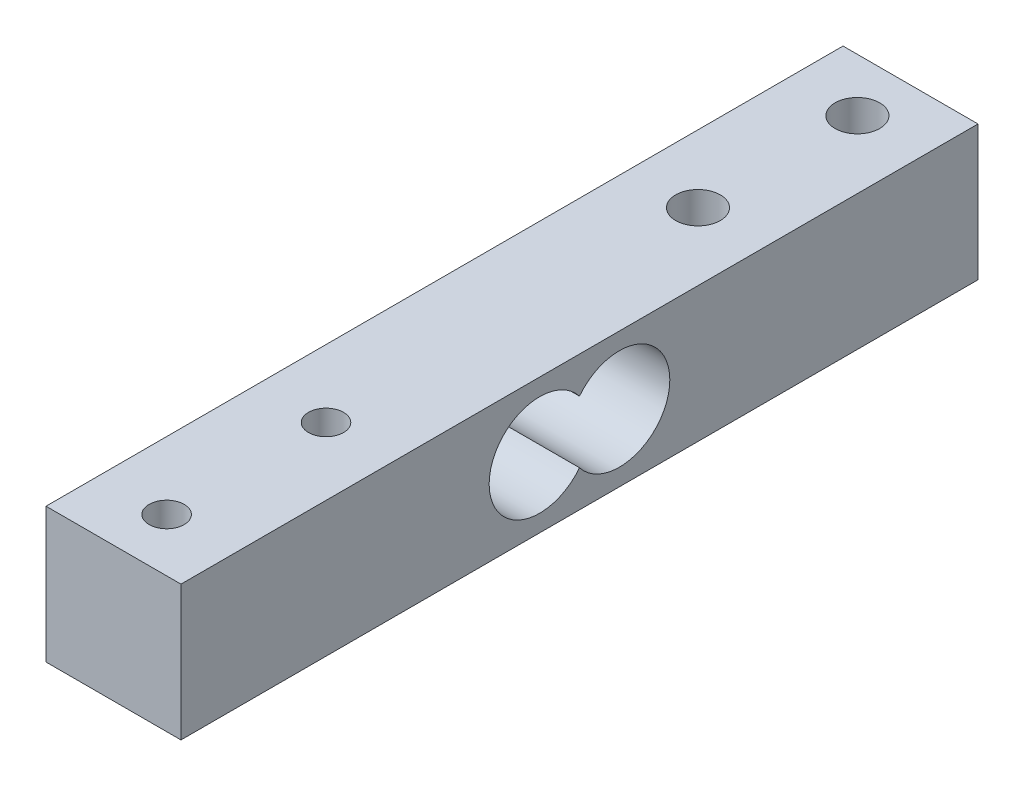
ISO-10303-21;
HEADER;
FILE_DESCRIPTION(('STEP AP214'),'2;1');
FILE_NAME('part.step','',(''),(''),'','','');
FILE_SCHEMA(('AUTOMOTIVE_DESIGN { 1 0 10303 214 1 1 1 1 }'));
ENDSEC;
DATA;
#1=APPLICATION_CONTEXT('core data for automotive mechanical design processes');
#2=APPLICATION_PROTOCOL_DEFINITION('international standard','automotive_design',2000,#1);
#3=PRODUCT_CONTEXT('',#1,'mechanical');
#4=PRODUCT('Part','Part','',(#3));
#5=PRODUCT_RELATED_PRODUCT_CATEGORY('part','',(#4));
#6=PRODUCT_DEFINITION_FORMATION('','',#4);
#7=PRODUCT_DEFINITION_CONTEXT('part definition',#1,'design');
#8=PRODUCT_DEFINITION('design','',#6,#7);
#9=PRODUCT_DEFINITION_SHAPE('','',#8);
#10=(LENGTH_UNIT() NAMED_UNIT(*) SI_UNIT(.MILLI.,.METRE.));
#11=(NAMED_UNIT(*) PLANE_ANGLE_UNIT() SI_UNIT($,.RADIAN.));
#12=(NAMED_UNIT(*) SI_UNIT($,.STERADIAN.) SOLID_ANGLE_UNIT());
#13=UNCERTAINTY_MEASURE_WITH_UNIT(LENGTH_MEASURE(1.E-05),#10,'distance_accuracy_value','');
#14=(GEOMETRIC_REPRESENTATION_CONTEXT(3) GLOBAL_UNCERTAINTY_ASSIGNED_CONTEXT((#13)) GLOBAL_UNIT_ASSIGNED_CONTEXT((#10,
#11,#12)) REPRESENTATION_CONTEXT('',''));
#15=CARTESIAN_POINT('',(0.,0.,0.));
#16=DIRECTION('',(0.,0.,1.));
#17=DIRECTION('',(1.,0.,0.));
#18=AXIS2_PLACEMENT_3D('',#15,#16,#17);
#19=CARTESIAN_POINT('',(6.35,6.35,-37.5));
#20=DIRECTION('',(-1.,0.,0.));
#21=DIRECTION('',(0.,0.,1.));
#22=AXIS2_PLACEMENT_3D('',#19,#20,#21);
#23=PLANE('',#22);
#24=CARTESIAN_POINT('',(6.35000000000001,0.,-3.75));
#25=DIRECTION('',(-1.,0.,0.));
#26=DIRECTION('',(0.,0.,1.));
#27=AXIS2_PLACEMENT_3D('',#24,#25,#26);
#28=CIRCLE('',#27,4.75);
#29=CARTESIAN_POINT('',(6.35000000000001,2.91547594742265,0.));
#30=VERTEX_POINT('',#29);
#31=CARTESIAN_POINT('',(6.35,-2.91547594742265,0.));
#32=VERTEX_POINT('',#31);
#33=EDGE_CURVE('E96',#30,#32,#28,.T.);
#34=ORIENTED_EDGE('',*,*,#33,.T.);
#35=CARTESIAN_POINT('',(6.35000000000001,0.,3.75));
#36=DIRECTION('',(-1.,0.,0.));
#37=DIRECTION('',(0.,0.,1.));
#38=AXIS2_PLACEMENT_3D('',#35,#36,#37);
#39=CIRCLE('',#38,4.75);
#40=EDGE_CURVE('E55',#32,#30,#39,.T.);
#41=ORIENTED_EDGE('',*,*,#40,.T.);
#42=EDGE_LOOP('',(#34,#41));
#43=FACE_BOUND('',#42,.T.);
#44=DIRECTION('',(0.,0.,-1.));
#45=VECTOR('',#44,1.);
#46=CARTESIAN_POINT('',(6.35,-6.35,-37.5));
#47=LINE('',#46,#45);
#48=CARTESIAN_POINT('',(6.35000000000001,-6.35,37.5));
#49=VERTEX_POINT('',#48);
#50=CARTESIAN_POINT('',(6.35,-6.35,-37.5));
#51=VERTEX_POINT('',#50);
#52=EDGE_CURVE('E125',#49,#51,#47,.T.);
#53=ORIENTED_EDGE('',*,*,#52,.T.);
#54=DIRECTION('',(0.,-1.,0.));
#55=VECTOR('',#54,1.);
#56=CARTESIAN_POINT('',(6.35,6.35,-37.5));
#57=LINE('',#56,#55);
#58=CARTESIAN_POINT('',(6.35,6.35,-37.5));
#59=VERTEX_POINT('',#58);
#60=EDGE_CURVE('E11',#59,#51,#57,.T.);
#61=ORIENTED_EDGE('',*,*,#60,.F.);
#62=DIRECTION('',(0.,0.,-1.));
#63=VECTOR('',#62,1.);
#64=CARTESIAN_POINT('',(6.35,6.35,-37.5));
#65=LINE('',#64,#63);
#66=CARTESIAN_POINT('',(6.35000000000001,6.35,37.5));
#67=VERTEX_POINT('',#66);
#68=EDGE_CURVE('E126',#67,#59,#65,.T.);
#69=ORIENTED_EDGE('',*,*,#68,.F.);
#70=DIRECTION('',(0.,-1.,0.));
#71=VECTOR('',#70,1.);
#72=CARTESIAN_POINT('',(6.35000000000001,6.35,37.5));
#73=LINE('',#72,#71);
#74=EDGE_CURVE('E136',#67,#49,#73,.T.);
#75=ORIENTED_EDGE('',*,*,#74,.T.);
#76=EDGE_LOOP('',(#53,#61,#69,#75));
#77=FACE_BOUND('',#76,.T.);
#78=ADVANCED_FACE('F39',(#43,#77),#23,.F.);
#79=CARTESIAN_POINT('',(-6.35,6.35,-37.5));
#80=DIRECTION('',(0.,0.,1.));
#81=DIRECTION('',(1.,0.,0.));
#82=AXIS2_PLACEMENT_3D('',#79,#80,#81);
#83=PLANE('',#82);
#84=DIRECTION('',(-1.,0.,0.));
#85=VECTOR('',#84,1.);
#86=CARTESIAN_POINT('',(-6.35,-6.35,-37.5));
#87=LINE('',#86,#85);
#88=CARTESIAN_POINT('',(-6.35,-6.35,-37.5));
#89=VERTEX_POINT('',#88);
#90=EDGE_CURVE('E139',#51,#89,#87,.T.);
#91=ORIENTED_EDGE('',*,*,#90,.T.);
#92=DIRECTION('',(0.,-1.,0.));
#93=VECTOR('',#92,1.);
#94=CARTESIAN_POINT('',(-6.35,6.35,-37.5));
#95=LINE('',#94,#93);
#96=CARTESIAN_POINT('',(-6.35,6.35,-37.5));
#97=VERTEX_POINT('',#96);
#98=EDGE_CURVE('E47',#97,#89,#95,.T.);
#99=ORIENTED_EDGE('',*,*,#98,.F.);
#100=DIRECTION('',(-1.,0.,0.));
#101=VECTOR('',#100,1.);
#102=CARTESIAN_POINT('',(-6.35,6.35,-37.5));
#103=LINE('',#102,#101);
#104=EDGE_CURVE('E129',#59,#97,#103,.T.);
#105=ORIENTED_EDGE('',*,*,#104,.F.);
#106=ORIENTED_EDGE('',*,*,#60,.T.);
#107=EDGE_LOOP('',(#91,#99,#105,#106));
#108=FACE_BOUND('',#107,.T.);
#109=ADVANCED_FACE('F184',(#108),#83,.F.);
#110=CARTESIAN_POINT('',(-6.35,6.35,-37.5));
#111=DIRECTION('',(1.,0.,0.));
#112=DIRECTION('',(0.,0.,-1.));
#113=AXIS2_PLACEMENT_3D('',#110,#111,#112);
#114=PLANE('',#113);
#115=CARTESIAN_POINT('',(-6.35,0.,-3.75));
#116=DIRECTION('',(-1.,0.,0.));
#117=DIRECTION('',(0.,0.,1.));
#118=AXIS2_PLACEMENT_3D('',#115,#116,#117);
#119=CIRCLE('',#118,4.75);
#120=CARTESIAN_POINT('',(-6.35,2.91547594742265,0.));
#121=VERTEX_POINT('',#120);
#122=CARTESIAN_POINT('',(-6.35,-2.91547594742265,0.));
#123=VERTEX_POINT('',#122);
#124=EDGE_CURVE('E103',#121,#123,#119,.T.);
#125=ORIENTED_EDGE('',*,*,#124,.F.);
#126=CARTESIAN_POINT('',(-6.35,0.,3.75));
#127=DIRECTION('',(-1.,0.,0.));
#128=DIRECTION('',(0.,0.,1.));
#129=AXIS2_PLACEMENT_3D('',#126,#127,#128);
#130=CIRCLE('',#129,4.75);
#131=EDGE_CURVE('E60',#123,#121,#130,.T.);
#132=ORIENTED_EDGE('',*,*,#131,.F.);
#133=EDGE_LOOP('',(#125,#132));
#134=FACE_BOUND('',#133,.T.);
#135=DIRECTION('',(0.,0.,1.));
#136=VECTOR('',#135,1.);
#137=CARTESIAN_POINT('',(-6.35,-6.35,-37.5));
#138=LINE('',#137,#136);
#139=CARTESIAN_POINT('',(-6.34999999999999,-6.35,37.5));
#140=VERTEX_POINT('',#139);
#141=EDGE_CURVE('E141',#89,#140,#138,.T.);
#142=ORIENTED_EDGE('',*,*,#141,.T.);
#143=DIRECTION('',(0.,-1.,0.));
#144=VECTOR('',#143,1.);
#145=CARTESIAN_POINT('',(-6.34999999999999,6.35,37.5));
#146=LINE('',#145,#144);
#147=CARTESIAN_POINT('',(-6.34999999999999,6.35,37.5));
#148=VERTEX_POINT('',#147);
#149=EDGE_CURVE('E146',#148,#140,#146,.T.);
#150=ORIENTED_EDGE('',*,*,#149,.F.);
#151=DIRECTION('',(0.,0.,1.));
#152=VECTOR('',#151,1.);
#153=CARTESIAN_POINT('',(-6.35,6.35,-37.5));
#154=LINE('',#153,#152);
#155=EDGE_CURVE('E132',#97,#148,#154,.T.);
#156=ORIENTED_EDGE('',*,*,#155,.F.);
#157=ORIENTED_EDGE('',*,*,#98,.T.);
#158=EDGE_LOOP('',(#142,#150,#156,#157));
#159=FACE_BOUND('',#158,.T.);
#160=ADVANCED_FACE('F189',(#134,#159),#114,.F.);
#161=CARTESIAN_POINT('',(-6.34999999999999,6.35,37.5));
#162=DIRECTION('',(0.,0.,-1.));
#163=DIRECTION('',(-1.,0.,0.));
#164=AXIS2_PLACEMENT_3D('',#161,#162,#163);
#165=PLANE('',#164);
#166=DIRECTION('',(1.,0.,0.));
#167=VECTOR('',#166,1.);
#168=CARTESIAN_POINT('',(-6.34999999999999,-6.35,37.5));
#169=LINE('',#168,#167);
#170=EDGE_CURVE('E130',#140,#49,#169,.T.);
#171=ORIENTED_EDGE('',*,*,#170,.T.);
#172=ORIENTED_EDGE('',*,*,#74,.F.);
#173=DIRECTION('',(1.,0.,0.));
#174=VECTOR('',#173,1.);
#175=CARTESIAN_POINT('',(-6.34999999999999,6.35,37.5));
#176=LINE('',#175,#174);
#177=EDGE_CURVE('E134',#148,#67,#176,.T.);
#178=ORIENTED_EDGE('',*,*,#177,.F.);
#179=ORIENTED_EDGE('',*,*,#149,.T.);
#180=EDGE_LOOP('',(#171,#172,#178,#179));
#181=FACE_BOUND('',#180,.T.);
#182=ADVANCED_FACE('F170',(#181),#165,.F.);
#183=CARTESIAN_POINT('',(0.,6.35,0.));
#184=DIRECTION('',(0.,1.,0.));
#185=DIRECTION('',(0.,0.,1.));
#186=AXIS2_PLACEMENT_3D('',#183,#184,#185);
#187=PLANE('',#186);
#188=CARTESIAN_POINT('',(0.,6.35,-32.5));
#189=DIRECTION('',(0.,1.,0.));
#190=DIRECTION('',(0.,0.,1.));
#191=AXIS2_PLACEMENT_3D('',#188,#189,#190);
#192=CIRCLE('',#191,2.1);
#193=CARTESIAN_POINT('',(0.,6.35,-30.4));
#194=VERTEX_POINT('',#193);
#195=EDGE_CURVE('E157',#194,#194,#192,.T.);
#196=ORIENTED_EDGE('',*,*,#195,.F.);
#197=EDGE_LOOP('',(#196));
#198=FACE_BOUND('',#197,.T.);
#199=CARTESIAN_POINT('',(0.,6.35,-17.5));
#200=DIRECTION('',(0.,1.,0.));
#201=DIRECTION('',(0.,0.,1.));
#202=AXIS2_PLACEMENT_3D('',#199,#200,#201);
#203=CIRCLE('',#202,2.1);
#204=CARTESIAN_POINT('',(0.,6.35,-15.4));
#205=VERTEX_POINT('',#204);
#206=EDGE_CURVE('E107',#205,#205,#203,.T.);
#207=ORIENTED_EDGE('',*,*,#206,.F.);
#208=EDGE_LOOP('',(#207));
#209=FACE_BOUND('',#208,.T.);
#210=CARTESIAN_POINT('',(0.,6.35,17.5));
#211=DIRECTION('',(0.,1.,0.));
#212=DIRECTION('',(0.,0.,1.));
#213=AXIS2_PLACEMENT_3D('',#210,#211,#212);
#214=CIRCLE('',#213,1.64999999999999);
#215=CARTESIAN_POINT('',(0.,6.35,19.15));
#216=VERTEX_POINT('',#215);
#217=EDGE_CURVE('E112',#216,#216,#214,.T.);
#218=ORIENTED_EDGE('',*,*,#217,.F.);
#219=EDGE_LOOP('',(#218));
#220=FACE_BOUND('',#219,.T.);
#221=CARTESIAN_POINT('',(0.,6.35,32.5));
#222=DIRECTION('',(0.,1.,0.));
#223=DIRECTION('',(0.,0.,1.));
#224=AXIS2_PLACEMENT_3D('',#221,#222,#223);
#225=CIRCLE('',#224,1.64999999999999);
#226=CARTESIAN_POINT('',(0.,6.35,34.15));
#227=VERTEX_POINT('',#226);
#228=EDGE_CURVE('E119',#227,#227,#225,.T.);
#229=ORIENTED_EDGE('',*,*,#228,.F.);
#230=EDGE_LOOP('',(#229));
#231=FACE_BOUND('',#230,.T.);
#232=ORIENTED_EDGE('',*,*,#68,.T.);
#233=ORIENTED_EDGE('',*,*,#104,.T.);
#234=ORIENTED_EDGE('',*,*,#155,.T.);
#235=ORIENTED_EDGE('',*,*,#177,.T.);
#236=EDGE_LOOP('',(#232,#233,#234,#235));
#237=FACE_BOUND('',#236,.T.);
#238=ADVANCED_FACE('F166',(#198,#209,#220,#231,#237),#187,.T.);
#239=CARTESIAN_POINT('',(0.,-6.35,0.));
#240=DIRECTION('',(0.,1.,0.));
#241=DIRECTION('',(0.,0.,1.));
#242=AXIS2_PLACEMENT_3D('',#239,#240,#241);
#243=PLANE('',#242);
#244=CARTESIAN_POINT('',(0.,-6.35,-32.5));
#245=DIRECTION('',(0.,1.,0.));
#246=DIRECTION('',(0.,0.,1.));
#247=AXIS2_PLACEMENT_3D('',#244,#245,#246);
#248=CIRCLE('',#247,2.1);
#249=CARTESIAN_POINT('',(0.,-6.35,-30.4));
#250=VERTEX_POINT('',#249);
#251=EDGE_CURVE('E42',#250,#250,#248,.T.);
#252=ORIENTED_EDGE('',*,*,#251,.T.);
#253=EDGE_LOOP('',(#252));
#254=FACE_BOUND('',#253,.T.);
#255=CARTESIAN_POINT('',(0.,-6.35,-17.5));
#256=DIRECTION('',(0.,1.,0.));
#257=DIRECTION('',(0.,0.,1.));
#258=AXIS2_PLACEMENT_3D('',#255,#256,#257);
#259=CIRCLE('',#258,2.1);
#260=CARTESIAN_POINT('',(0.,-6.35,-15.4));
#261=VERTEX_POINT('',#260);
#262=EDGE_CURVE('E110',#261,#261,#259,.T.);
#263=ORIENTED_EDGE('',*,*,#262,.T.);
#264=EDGE_LOOP('',(#263));
#265=FACE_BOUND('',#264,.T.);
#266=CARTESIAN_POINT('',(0.,-6.35,17.5));
#267=DIRECTION('',(0.,1.,0.));
#268=DIRECTION('',(0.,0.,1.));
#269=AXIS2_PLACEMENT_3D('',#266,#267,#268);
#270=CIRCLE('',#269,1.65);
#271=CARTESIAN_POINT('',(0.,-6.35,19.15));
#272=VERTEX_POINT('',#271);
#273=EDGE_CURVE('E116',#272,#272,#270,.T.);
#274=ORIENTED_EDGE('',*,*,#273,.T.);
#275=EDGE_LOOP('',(#274));
#276=FACE_BOUND('',#275,.T.);
#277=CARTESIAN_POINT('',(0.,-6.35,32.5));
#278=DIRECTION('',(0.,1.,0.));
#279=DIRECTION('',(0.,0.,1.));
#280=AXIS2_PLACEMENT_3D('',#277,#278,#279);
#281=CIRCLE('',#280,1.65);
#282=CARTESIAN_POINT('',(0.,-6.35,34.15));
#283=VERTEX_POINT('',#282);
#284=EDGE_CURVE('E122',#283,#283,#281,.T.);
#285=ORIENTED_EDGE('',*,*,#284,.T.);
#286=EDGE_LOOP('',(#285));
#287=FACE_BOUND('',#286,.T.);
#288=ORIENTED_EDGE('',*,*,#52,.F.);
#289=ORIENTED_EDGE('',*,*,#170,.F.);
#290=ORIENTED_EDGE('',*,*,#141,.F.);
#291=ORIENTED_EDGE('',*,*,#90,.F.);
#292=EDGE_LOOP('',(#288,#289,#290,#291));
#293=FACE_BOUND('',#292,.T.);
#294=ADVANCED_FACE('F169',(#254,#265,#276,#287,#293),#243,.F.);
#295=CARTESIAN_POINT('',(0.,6.35,32.5));
#296=DIRECTION('',(0.,1.,0.));
#297=DIRECTION('',(0.,0.,1.));
#298=AXIS2_PLACEMENT_3D('',#295,#296,#297);
#299=CYLINDRICAL_SURFACE('',#298,1.64999999999999);
#300=ORIENTED_EDGE('',*,*,#284,.F.);
#301=EDGE_LOOP('',(#300));
#302=FACE_BOUND('',#301,.T.);
#303=ORIENTED_EDGE('',*,*,#228,.T.);
#304=EDGE_LOOP('',(#303));
#305=FACE_BOUND('',#304,.T.);
#306=ADVANCED_FACE('F194',(#302,#305),#299,.F.);
#307=CARTESIAN_POINT('',(0.,6.35,17.5));
#308=DIRECTION('',(0.,1.,0.));
#309=DIRECTION('',(0.,0.,1.));
#310=AXIS2_PLACEMENT_3D('',#307,#308,#309);
#311=CYLINDRICAL_SURFACE('',#310,1.64999999999999);
#312=ORIENTED_EDGE('',*,*,#273,.F.);
#313=EDGE_LOOP('',(#312));
#314=FACE_BOUND('',#313,.T.);
#315=ORIENTED_EDGE('',*,*,#217,.T.);
#316=EDGE_LOOP('',(#315));
#317=FACE_BOUND('',#316,.T.);
#318=ADVANCED_FACE('F200',(#314,#317),#311,.F.);
#319=CARTESIAN_POINT('',(6.35000000000001,0.,3.75));
#320=DIRECTION('',(-1.,0.,0.));
#321=DIRECTION('',(0.,0.,1.));
#322=AXIS2_PLACEMENT_3D('',#319,#320,#321);
#323=CYLINDRICAL_SURFACE('',#322,4.75);
#324=ORIENTED_EDGE('',*,*,#131,.T.);
#325=DIRECTION('',(-1.,0.,0.));
#326=VECTOR('',#325,1.);
#327=CARTESIAN_POINT('',(6.35000000000001,2.91547594742265,0.));
#328=LINE('',#327,#326);
#329=EDGE_CURVE('E89',#30,#121,#328,.T.);
#330=ORIENTED_EDGE('',*,*,#329,.F.);
#331=ORIENTED_EDGE('',*,*,#40,.F.);
#332=DIRECTION('',(-1.,0.,0.));
#333=VECTOR('',#332,1.);
#334=CARTESIAN_POINT('',(6.35000000000001,-2.91547594742265,0.));
#335=LINE('',#334,#333);
#336=EDGE_CURVE('E95',#32,#123,#335,.T.);
#337=ORIENTED_EDGE('',*,*,#336,.T.);
#338=EDGE_LOOP('',(#324,#330,#331,#337));
#339=FACE_BOUND('',#338,.T.);
#340=ADVANCED_FACE('F91',(#339),#323,.F.);
#341=CARTESIAN_POINT('',(6.35000000000001,0.,-3.75));
#342=DIRECTION('',(-1.,0.,0.));
#343=DIRECTION('',(0.,0.,1.));
#344=AXIS2_PLACEMENT_3D('',#341,#342,#343);
#345=CYLINDRICAL_SURFACE('',#344,4.75);
#346=ORIENTED_EDGE('',*,*,#124,.T.);
#347=ORIENTED_EDGE('',*,*,#336,.F.);
#348=ORIENTED_EDGE('',*,*,#33,.F.);
#349=ORIENTED_EDGE('',*,*,#329,.T.);
#350=EDGE_LOOP('',(#346,#347,#348,#349));
#351=FACE_BOUND('',#350,.T.);
#352=ADVANCED_FACE('F99',(#351),#345,.F.);
#353=CARTESIAN_POINT('',(0.,6.35,-17.5));
#354=DIRECTION('',(0.,1.,0.));
#355=DIRECTION('',(0.,0.,1.));
#356=AXIS2_PLACEMENT_3D('',#353,#354,#355);
#357=CYLINDRICAL_SURFACE('',#356,2.1);
#358=ORIENTED_EDGE('',*,*,#206,.T.);
#359=EDGE_LOOP('',(#358));
#360=FACE_BOUND('',#359,.T.);
#361=ORIENTED_EDGE('',*,*,#262,.F.);
#362=EDGE_LOOP('',(#361));
#363=FACE_BOUND('',#362,.T.);
#364=ADVANCED_FACE('F249',(#360,#363),#357,.F.);
#365=CARTESIAN_POINT('',(0.,6.35,-32.5));
#366=DIRECTION('',(0.,1.,0.));
#367=DIRECTION('',(0.,0.,1.));
#368=AXIS2_PLACEMENT_3D('',#365,#366,#367);
#369=CYLINDRICAL_SURFACE('',#368,2.1);
#370=ORIENTED_EDGE('',*,*,#195,.T.);
#371=EDGE_LOOP('',(#370));
#372=FACE_BOUND('',#371,.T.);
#373=ORIENTED_EDGE('',*,*,#251,.F.);
#374=EDGE_LOOP('',(#373));
#375=FACE_BOUND('',#374,.T.);
#376=ADVANCED_FACE('F163',(#372,#375),#369,.F.);
#377=CLOSED_SHELL('',(#78,#109,#160,#182,#238,#294,#306,#318,#340,#352,#364,#376));
#378=MANIFOLD_SOLID_BREP('B2',#377);
#379=ADVANCED_BREP_SHAPE_REPRESENTATION('',(#18,#378),#14);
#380=SHAPE_DEFINITION_REPRESENTATION(#9,#379);
ENDSEC;
END-ISO-10303-21;
